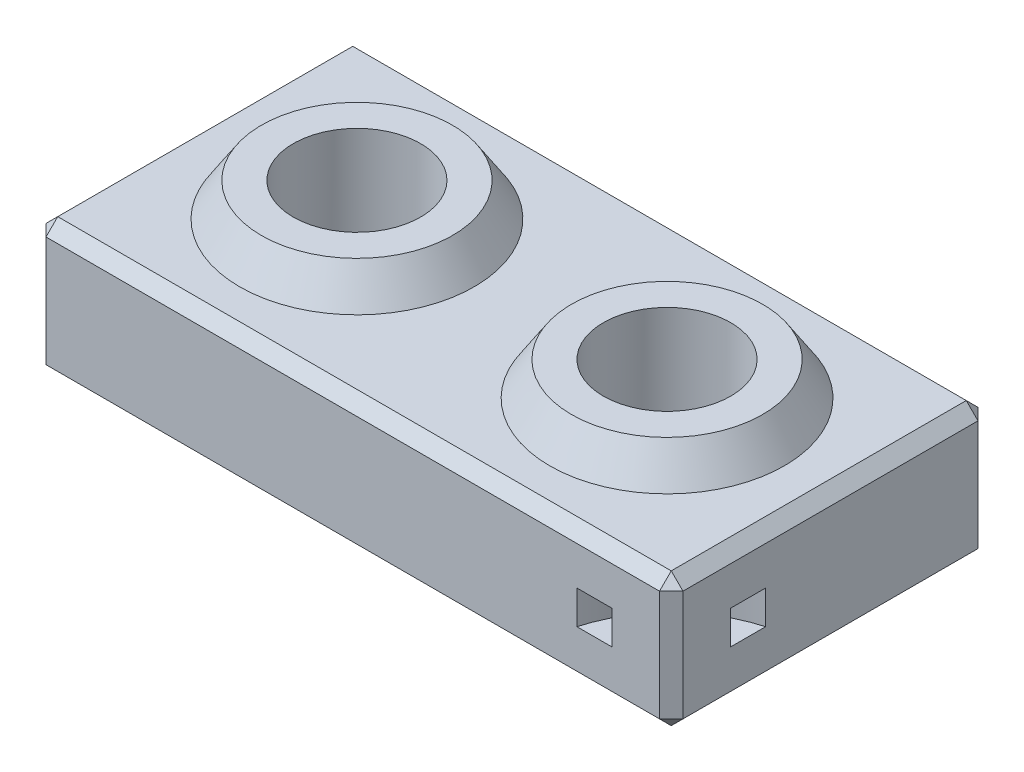
ISO-10303-21;
HEADER;
FILE_DESCRIPTION(('STEP AP214'),'2;1');
FILE_NAME('part.step','',(''),(''),'','','');
FILE_SCHEMA(('AUTOMOTIVE_DESIGN { 1 0 10303 214 1 1 1 1 }'));
ENDSEC;
DATA;
#1=APPLICATION_CONTEXT('core data for automotive mechanical design processes');
#2=APPLICATION_PROTOCOL_DEFINITION('international standard','automotive_design',2000,#1);
#3=PRODUCT_CONTEXT('',#1,'mechanical');
#4=PRODUCT('Part','Part','',(#3));
#5=PRODUCT_RELATED_PRODUCT_CATEGORY('part','',(#4));
#6=PRODUCT_DEFINITION_FORMATION('','',#4);
#7=PRODUCT_DEFINITION_CONTEXT('part definition',#1,'design');
#8=PRODUCT_DEFINITION('design','',#6,#7);
#9=PRODUCT_DEFINITION_SHAPE('','',#8);
#10=(LENGTH_UNIT() NAMED_UNIT(*) SI_UNIT(.MILLI.,.METRE.));
#11=(NAMED_UNIT(*) PLANE_ANGLE_UNIT() SI_UNIT($,.RADIAN.));
#12=(NAMED_UNIT(*) SI_UNIT($,.STERADIAN.) SOLID_ANGLE_UNIT());
#13=UNCERTAINTY_MEASURE_WITH_UNIT(LENGTH_MEASURE(1.E-05),#10,'distance_accuracy_value','');
#14=(GEOMETRIC_REPRESENTATION_CONTEXT(3) GLOBAL_UNCERTAINTY_ASSIGNED_CONTEXT((#13)) GLOBAL_UNIT_ASSIGNED_CONTEXT((#10,
#11,#12)) REPRESENTATION_CONTEXT('',''));
#15=CARTESIAN_POINT('',(0.,0.,0.));
#16=DIRECTION('',(0.,0.,1.));
#17=DIRECTION('',(1.,0.,0.));
#18=AXIS2_PLACEMENT_3D('',#15,#16,#17);
#19=CARTESIAN_POINT('',(9.25,0.,0.));
#20=DIRECTION('',(0.,1.,0.));
#21=DIRECTION('',(0.,0.,1.));
#22=AXIS2_PLACEMENT_3D('',#19,#20,#21);
#23=CYLINDRICAL_SURFACE('',#22,3.8);
#24=CARTESIAN_POINT('',(9.25,10.,0.));
#25=DIRECTION('',(0.,1.,0.));
#26=DIRECTION('',(0.,0.,1.));
#27=AXIS2_PLACEMENT_3D('',#24,#25,#26);
#28=CIRCLE('',#27,3.8);
#29=CARTESIAN_POINT('',(9.25,10.,3.8));
#30=VERTEX_POINT('',#29);
#31=EDGE_CURVE('E181',#30,#30,#28,.T.);
#32=ORIENTED_EDGE('',*,*,#31,.T.);
#33=EDGE_LOOP('',(#32));
#34=FACE_BOUND('',#33,.T.);
#35=CARTESIAN_POINT('',(9.25,2.2,0.));
#36=DIRECTION('',(0.,-1.,0.));
#37=DIRECTION('',(0.,0.,-1.));
#38=AXIS2_PLACEMENT_3D('',#35,#36,#37);
#39=CIRCLE('',#38,3.8);
#40=CARTESIAN_POINT('',(9.25,2.2,-3.8));
#41=VERTEX_POINT('',#40);
#42=EDGE_CURVE('E271',#41,#41,#39,.F.);
#43=ORIENTED_EDGE('',*,*,#42,.F.);
#44=EDGE_LOOP('',(#43));
#45=FACE_BOUND('',#44,.T.);
#46=ADVANCED_FACE('F37',(#34,#45),#23,.F.);
#47=CARTESIAN_POINT('',(-9.25,0.,0.));
#48=DIRECTION('',(0.,1.,0.));
#49=DIRECTION('',(0.,0.,1.));
#50=AXIS2_PLACEMENT_3D('',#47,#48,#49);
#51=CYLINDRICAL_SURFACE('',#50,3.8);
#52=CARTESIAN_POINT('',(-9.25,10.,0.));
#53=DIRECTION('',(0.,1.,0.));
#54=DIRECTION('',(0.,0.,1.));
#55=AXIS2_PLACEMENT_3D('',#52,#53,#54);
#56=CIRCLE('',#55,3.8);
#57=CARTESIAN_POINT('',(-9.25,10.,3.8));
#58=VERTEX_POINT('',#57);
#59=EDGE_CURVE('E186',#58,#58,#56,.T.);
#60=ORIENTED_EDGE('',*,*,#59,.T.);
#61=EDGE_LOOP('',(#60));
#62=FACE_BOUND('',#61,.T.);
#63=CARTESIAN_POINT('',(-9.25,2.2,0.));
#64=DIRECTION('',(0.,-1.,0.));
#65=DIRECTION('',(0.,0.,-1.));
#66=AXIS2_PLACEMENT_3D('',#63,#64,#65);
#67=CIRCLE('',#66,3.8);
#68=CARTESIAN_POINT('',(-9.25,2.2,-3.8));
#69=VERTEX_POINT('',#68);
#70=EDGE_CURVE('E176',#69,#69,#67,.F.);
#71=ORIENTED_EDGE('',*,*,#70,.F.);
#72=EDGE_LOOP('',(#71));
#73=FACE_BOUND('',#72,.T.);
#74=ADVANCED_FACE('F427',(#62,#73),#51,.F.);
#75=CARTESIAN_POINT('',(19.,8.,-9.5));
#76=DIRECTION('',(-1.,0.,0.));
#77=DIRECTION('',(0.,0.,1.));
#78=AXIS2_PLACEMENT_3D('',#75,#76,#77);
#79=PLANE('',#78);
#80=DIRECTION('',(0.,0.,-1.));
#81=VECTOR('',#80,1.);
#82=CARTESIAN_POINT('',(19.,5.,-9.5));
#83=LINE('',#82,#81);
#84=CARTESIAN_POINT('',(19.,5.,5.97568113595216));
#85=VERTEX_POINT('',#84);
#86=CARTESIAN_POINT('',(19.,5.,3.86762218499362));
#87=VERTEX_POINT('',#86);
#88=EDGE_CURVE('E154',#85,#87,#83,.T.);
#89=ORIENTED_EDGE('',*,*,#88,.T.);
#90=DIRECTION('',(0.,1.,0.));
#91=VECTOR('',#90,1.);
#92=CARTESIAN_POINT('',(19.,3.,3.86762218499362));
#93=LINE('',#92,#91);
#94=CARTESIAN_POINT('',(19.,3.,3.86762218499362));
#95=VERTEX_POINT('',#94);
#96=EDGE_CURVE('E170',#87,#95,#93,.F.);
#97=ORIENTED_EDGE('',*,*,#96,.T.);
#98=DIRECTION('',(0.,0.,-1.));
#99=VECTOR('',#98,1.);
#100=CARTESIAN_POINT('',(19.,3.,-9.5));
#101=LINE('',#100,#99);
#102=CARTESIAN_POINT('',(19.,3.,5.97568113595216));
#103=VERTEX_POINT('',#102);
#104=EDGE_CURVE('E160',#103,#95,#101,.T.);
#105=ORIENTED_EDGE('',*,*,#104,.F.);
#106=DIRECTION('',(0.,1.,0.));
#107=VECTOR('',#106,1.);
#108=CARTESIAN_POINT('',(19.,3.,5.97568113595216));
#109=LINE('',#108,#107);
#110=EDGE_CURVE('E148',#85,#103,#109,.F.);
#111=ORIENTED_EDGE('',*,*,#110,.F.);
#112=EDGE_LOOP('',(#89,#97,#105,#111));
#113=FACE_BOUND('',#112,.T.);
#114=DIRECTION('',(0.,0.,-1.));
#115=VECTOR('',#114,1.);
#116=CARTESIAN_POINT('',(19.,0.699999999999999,-9.5));
#117=LINE('',#116,#115);
#118=CARTESIAN_POINT('',(19.,0.699999999999999,8.8));
#119=VERTEX_POINT('',#118);
#120=CARTESIAN_POINT('',(19.,0.699999999999999,-8.8));
#121=VERTEX_POINT('',#120);
#122=EDGE_CURVE('E205',#119,#121,#117,.T.);
#123=ORIENTED_EDGE('',*,*,#122,.T.);
#124=DIRECTION('',(0.,1.,0.));
#125=VECTOR('',#124,1.);
#126=CARTESIAN_POINT('',(19.,8.,-8.8));
#127=LINE('',#126,#125);
#128=CARTESIAN_POINT('',(19.,7.3,-8.8));
#129=VERTEX_POINT('',#128);
#130=EDGE_CURVE('E212',#121,#129,#127,.T.);
#131=ORIENTED_EDGE('',*,*,#130,.T.);
#132=DIRECTION('',(0.,0.,1.));
#133=VECTOR('',#132,1.);
#134=CARTESIAN_POINT('',(19.,7.3,9.5));
#135=LINE('',#134,#133);
#136=CARTESIAN_POINT('',(19.,7.3,8.8));
#137=VERTEX_POINT('',#136);
#138=EDGE_CURVE('E208',#129,#137,#135,.T.);
#139=ORIENTED_EDGE('',*,*,#138,.T.);
#140=DIRECTION('',(0.,-1.,0.));
#141=VECTOR('',#140,1.);
#142=CARTESIAN_POINT('',(19.,8.,8.8));
#143=LINE('',#142,#141);
#144=EDGE_CURVE('E202',#137,#119,#143,.T.);
#145=ORIENTED_EDGE('',*,*,#144,.T.);
#146=EDGE_LOOP('',(#123,#131,#139,#145));
#147=FACE_BOUND('',#146,.T.);
#148=ADVANCED_FACE('F168',(#113,#147),#79,.F.);
#149=CARTESIAN_POINT('',(-19.,8.,-9.5));
#150=DIRECTION('',(0.,0.,1.));
#151=DIRECTION('',(1.,0.,0.));
#152=AXIS2_PLACEMENT_3D('',#149,#150,#151);
#153=PLANE('',#152);
#154=DIRECTION('',(1.,0.,0.));
#155=VECTOR('',#154,1.);
#156=CARTESIAN_POINT('',(19.,7.3,-9.5));
#157=LINE('',#156,#155);
#158=CARTESIAN_POINT('',(-18.3,7.3,-9.5));
#159=VERTEX_POINT('',#158);
#160=CARTESIAN_POINT('',(18.3,7.3,-9.5));
#161=VERTEX_POINT('',#160);
#162=EDGE_CURVE('E234',#159,#161,#157,.T.);
#163=ORIENTED_EDGE('',*,*,#162,.T.);
#164=DIRECTION('',(0.,-1.,0.));
#165=VECTOR('',#164,1.);
#166=CARTESIAN_POINT('',(18.3,8.,-9.5));
#167=LINE('',#166,#165);
#168=CARTESIAN_POINT('',(18.3,0.699999999999999,-9.5));
#169=VERTEX_POINT('',#168);
#170=EDGE_CURVE('E237',#161,#169,#167,.T.);
#171=ORIENTED_EDGE('',*,*,#170,.T.);
#172=DIRECTION('',(-1.,0.,0.));
#173=VECTOR('',#172,1.);
#174=CARTESIAN_POINT('',(-19.,0.699999999999999,-9.5));
#175=LINE('',#174,#173);
#176=CARTESIAN_POINT('',(-18.3,0.699999999999999,-9.5));
#177=VERTEX_POINT('',#176);
#178=EDGE_CURVE('E231',#169,#177,#175,.T.);
#179=ORIENTED_EDGE('',*,*,#178,.T.);
#180=DIRECTION('',(0.,1.,0.));
#181=VECTOR('',#180,1.);
#182=CARTESIAN_POINT('',(-18.3,8.,-9.5));
#183=LINE('',#182,#181);
#184=EDGE_CURVE('E228',#177,#159,#183,.T.);
#185=ORIENTED_EDGE('',*,*,#184,.T.);
#186=EDGE_LOOP('',(#163,#171,#179,#185));
#187=FACE_BOUND('',#186,.T.);
#188=ADVANCED_FACE('F462',(#187),#153,.F.);
#189=CARTESIAN_POINT('',(-19.,8.,-9.5));
#190=DIRECTION('',(1.,0.,0.));
#191=DIRECTION('',(0.,0.,-1.));
#192=AXIS2_PLACEMENT_3D('',#189,#190,#191);
#193=PLANE('',#192);
#194=DIRECTION('',(0.,0.,-1.));
#195=VECTOR('',#194,1.);
#196=CARTESIAN_POINT('',(-19.,7.3,-9.5));
#197=LINE('',#196,#195);
#198=CARTESIAN_POINT('',(-19.,7.3,8.8));
#199=VERTEX_POINT('',#198);
#200=CARTESIAN_POINT('',(-19.,7.3,-8.8));
#201=VERTEX_POINT('',#200);
#202=EDGE_CURVE('E247',#199,#201,#197,.T.);
#203=ORIENTED_EDGE('',*,*,#202,.T.);
#204=DIRECTION('',(0.,-1.,0.));
#205=VECTOR('',#204,1.);
#206=CARTESIAN_POINT('',(-19.,8.,-8.8));
#207=LINE('',#206,#205);
#208=CARTESIAN_POINT('',(-19.,0.699999999999999,-8.8));
#209=VERTEX_POINT('',#208);
#210=EDGE_CURVE('E250',#201,#209,#207,.T.);
#211=ORIENTED_EDGE('',*,*,#210,.T.);
#212=DIRECTION('',(0.,0.,1.));
#213=VECTOR('',#212,1.);
#214=CARTESIAN_POINT('',(-19.,0.699999999999999,-9.5));
#215=LINE('',#214,#213);
#216=CARTESIAN_POINT('',(-19.,0.699999999999999,8.8));
#217=VERTEX_POINT('',#216);
#218=EDGE_CURVE('E244',#209,#217,#215,.T.);
#219=ORIENTED_EDGE('',*,*,#218,.T.);
#220=DIRECTION('',(0.,1.,0.));
#221=VECTOR('',#220,1.);
#222=CARTESIAN_POINT('',(-19.,8.,8.8));
#223=LINE('',#222,#221);
#224=EDGE_CURVE('E241',#217,#199,#223,.T.);
#225=ORIENTED_EDGE('',*,*,#224,.T.);
#226=EDGE_LOOP('',(#203,#211,#219,#225));
#227=FACE_BOUND('',#226,.T.);
#228=ADVANCED_FACE('F459',(#227),#193,.F.);
#229=CARTESIAN_POINT('',(-19.,8.,9.5));
#230=DIRECTION('',(0.,0.,-1.));
#231=DIRECTION('',(-1.,0.,0.));
#232=AXIS2_PLACEMENT_3D('',#229,#230,#231);
#233=PLANE('',#232);
#234=DIRECTION('',(1.,0.,0.));
#235=VECTOR('',#234,1.);
#236=CARTESIAN_POINT('',(-19.,3.,9.5));
#237=LINE('',#236,#235);
#238=CARTESIAN_POINT('',(13.3676221849936,3.,9.5));
#239=VERTEX_POINT('',#238);
#240=CARTESIAN_POINT('',(15.4756811359522,3.,9.5));
#241=VERTEX_POINT('',#240);
#242=EDGE_CURVE('E46',#239,#241,#237,.T.);
#243=ORIENTED_EDGE('',*,*,#242,.F.);
#244=DIRECTION('',(0.,1.,0.));
#245=VECTOR('',#244,1.);
#246=CARTESIAN_POINT('',(13.3676221849936,3.,9.5));
#247=LINE('',#246,#245);
#248=CARTESIAN_POINT('',(13.3676221849936,5.,9.5));
#249=VERTEX_POINT('',#248);
#250=EDGE_CURVE('E11',#239,#249,#247,.T.);
#251=ORIENTED_EDGE('',*,*,#250,.T.);
#252=DIRECTION('',(1.,0.,0.));
#253=VECTOR('',#252,1.);
#254=CARTESIAN_POINT('',(-19.,5.,9.5));
#255=LINE('',#254,#253);
#256=CARTESIAN_POINT('',(15.4756811359522,5.,9.5));
#257=VERTEX_POINT('',#256);
#258=EDGE_CURVE('E398',#249,#257,#255,.T.);
#259=ORIENTED_EDGE('',*,*,#258,.T.);
#260=DIRECTION('',(0.,1.,0.));
#261=VECTOR('',#260,1.);
#262=CARTESIAN_POINT('',(15.4756811359522,3.,9.5));
#263=LINE('',#262,#261);
#264=EDGE_CURVE('E395',#241,#257,#263,.T.);
#265=ORIENTED_EDGE('',*,*,#264,.F.);
#266=EDGE_LOOP('',(#243,#251,#259,#265));
#267=FACE_BOUND('',#266,.T.);
#268=DIRECTION('',(-1.,0.,0.));
#269=VECTOR('',#268,1.);
#270=CARTESIAN_POINT('',(-19.,7.3,9.5));
#271=LINE('',#270,#269);
#272=CARTESIAN_POINT('',(18.3,7.3,9.5));
#273=VERTEX_POINT('',#272);
#274=CARTESIAN_POINT('',(-18.3,7.3,9.5));
#275=VERTEX_POINT('',#274);
#276=EDGE_CURVE('E260',#273,#275,#271,.T.);
#277=ORIENTED_EDGE('',*,*,#276,.T.);
#278=DIRECTION('',(0.,-1.,0.));
#279=VECTOR('',#278,1.);
#280=CARTESIAN_POINT('',(-18.3,8.,9.5));
#281=LINE('',#280,#279);
#282=CARTESIAN_POINT('',(-18.3,0.699999999999999,9.5));
#283=VERTEX_POINT('',#282);
#284=EDGE_CURVE('E263',#275,#283,#281,.T.);
#285=ORIENTED_EDGE('',*,*,#284,.T.);
#286=DIRECTION('',(1.,0.,0.));
#287=VECTOR('',#286,1.);
#288=CARTESIAN_POINT('',(-19.,0.699999999999999,9.5));
#289=LINE('',#288,#287);
#290=CARTESIAN_POINT('',(18.3,0.699999999999999,9.5));
#291=VERTEX_POINT('',#290);
#292=EDGE_CURVE('E254',#283,#291,#289,.T.);
#293=ORIENTED_EDGE('',*,*,#292,.T.);
#294=DIRECTION('',(0.,1.,0.));
#295=VECTOR('',#294,1.);
#296=CARTESIAN_POINT('',(18.3,8.,9.5));
#297=LINE('',#296,#295);
#298=EDGE_CURVE('E257',#291,#273,#297,.T.);
#299=ORIENTED_EDGE('',*,*,#298,.T.);
#300=EDGE_LOOP('',(#277,#285,#293,#299));
#301=FACE_BOUND('',#300,.T.);
#302=ADVANCED_FACE('F414',(#267,#301),#233,.F.);
#303=CARTESIAN_POINT('',(0.,8.,0.));
#304=DIRECTION('',(0.,1.,0.));
#305=DIRECTION('',(0.,0.,1.));
#306=AXIS2_PLACEMENT_3D('',#303,#304,#305);
#307=PLANE('',#306);
#308=CARTESIAN_POINT('',(9.25,8.,0.));
#309=DIRECTION('',(0.,1.,0.));
#310=DIRECTION('',(0.,0.,1.));
#311=AXIS2_PLACEMENT_3D('',#308,#309,#310);
#312=CIRCLE('',#311,7.00000000000002);
#313=CARTESIAN_POINT('',(9.25,8.,7.00000000000002));
#314=VERTEX_POINT('',#313);
#315=EDGE_CURVE('E375',#314,#314,#312,.F.);
#316=ORIENTED_EDGE('',*,*,#315,.T.);
#317=EDGE_LOOP('',(#316));
#318=FACE_BOUND('',#317,.T.);
#319=CARTESIAN_POINT('',(-9.25,8.,0.));
#320=DIRECTION('',(0.,1.,0.));
#321=DIRECTION('',(0.,0.,1.));
#322=AXIS2_PLACEMENT_3D('',#319,#320,#321);
#323=CIRCLE('',#322,7.00000000000002);
#324=CARTESIAN_POINT('',(-9.25,8.,7.00000000000002));
#325=VERTEX_POINT('',#324);
#326=EDGE_CURVE('E371',#325,#325,#323,.F.);
#327=ORIENTED_EDGE('',*,*,#326,.T.);
#328=EDGE_LOOP('',(#327));
#329=FACE_BOUND('',#328,.T.);
#330=DIRECTION('',(1.,0.,0.));
#331=VECTOR('',#330,1.);
#332=CARTESIAN_POINT('',(19.,8.,8.8));
#333=LINE('',#332,#331);
#334=CARTESIAN_POINT('',(-18.3,8.,8.8));
#335=VERTEX_POINT('',#334);
#336=CARTESIAN_POINT('',(18.3,8.,8.8));
#337=VERTEX_POINT('',#336);
#338=EDGE_CURVE('E185',#335,#337,#333,.T.);
#339=ORIENTED_EDGE('',*,*,#338,.T.);
#340=DIRECTION('',(0.,0.,-1.));
#341=VECTOR('',#340,1.);
#342=CARTESIAN_POINT('',(18.3,8.,-9.5));
#343=LINE('',#342,#341);
#344=CARTESIAN_POINT('',(18.3,8.,-8.8));
#345=VERTEX_POINT('',#344);
#346=EDGE_CURVE('E198',#337,#345,#343,.T.);
#347=ORIENTED_EDGE('',*,*,#346,.T.);
#348=DIRECTION('',(-1.,0.,0.));
#349=VECTOR('',#348,1.);
#350=CARTESIAN_POINT('',(-19.,8.,-8.8));
#351=LINE('',#350,#349);
#352=CARTESIAN_POINT('',(-18.3,8.,-8.8));
#353=VERTEX_POINT('',#352);
#354=EDGE_CURVE('E195',#345,#353,#351,.T.);
#355=ORIENTED_EDGE('',*,*,#354,.T.);
#356=DIRECTION('',(0.,0.,1.));
#357=VECTOR('',#356,1.);
#358=CARTESIAN_POINT('',(-18.3,8.,9.5));
#359=LINE('',#358,#357);
#360=EDGE_CURVE('E192',#353,#335,#359,.T.);
#361=ORIENTED_EDGE('',*,*,#360,.T.);
#362=EDGE_LOOP('',(#339,#347,#355,#361));
#363=FACE_BOUND('',#362,.T.);
#364=ADVANCED_FACE('F450',(#318,#329,#363),#307,.T.);
#365=CARTESIAN_POINT('',(0.,0.,0.));
#366=DIRECTION('',(0.,1.,0.));
#367=DIRECTION('',(0.,0.,1.));
#368=AXIS2_PLACEMENT_3D('',#365,#366,#367);
#369=PLANE('',#368);
#370=CARTESIAN_POINT('',(-9.25,0.,0.));
#371=DIRECTION('',(0.,1.,0.));
#372=DIRECTION('',(0.,0.,1.));
#373=AXIS2_PLACEMENT_3D('',#370,#371,#372);
#374=CIRCLE('',#373,7.25000000000002);
#375=CARTESIAN_POINT('',(-9.25,0.,7.25000000000002));
#376=VERTEX_POINT('',#375);
#377=EDGE_CURVE('E367',#376,#376,#374,.T.);
#378=ORIENTED_EDGE('',*,*,#377,.T.);
#379=EDGE_LOOP('',(#378));
#380=FACE_BOUND('',#379,.T.);
#381=CARTESIAN_POINT('',(9.25,0.,0.));
#382=DIRECTION('',(0.,1.,0.));
#383=DIRECTION('',(0.,0.,1.));
#384=AXIS2_PLACEMENT_3D('',#381,#382,#383);
#385=CIRCLE('',#384,7.25000000000002);
#386=CARTESIAN_POINT('',(9.25,0.,7.25000000000002));
#387=VERTEX_POINT('',#386);
#388=EDGE_CURVE('E266',#387,#387,#385,.T.);
#389=ORIENTED_EDGE('',*,*,#388,.T.);
#390=EDGE_LOOP('',(#389));
#391=FACE_BOUND('',#390,.T.);
#392=DIRECTION('',(1.,0.,0.));
#393=VECTOR('',#392,1.);
#394=CARTESIAN_POINT('',(0.,0.,-8.8));
#395=LINE('',#394,#393);
#396=CARTESIAN_POINT('',(-18.3,0.,-8.8));
#397=VERTEX_POINT('',#396);
#398=CARTESIAN_POINT('',(18.3,0.,-8.8));
#399=VERTEX_POINT('',#398);
#400=EDGE_CURVE('E221',#397,#399,#395,.T.);
#401=ORIENTED_EDGE('',*,*,#400,.T.);
#402=DIRECTION('',(0.,0.,1.));
#403=VECTOR('',#402,1.);
#404=CARTESIAN_POINT('',(18.3,0.,0.));
#405=LINE('',#404,#403);
#406=CARTESIAN_POINT('',(18.3,0.,8.8));
#407=VERTEX_POINT('',#406);
#408=EDGE_CURVE('E224',#399,#407,#405,.T.);
#409=ORIENTED_EDGE('',*,*,#408,.T.);
#410=DIRECTION('',(-1.,0.,0.));
#411=VECTOR('',#410,1.);
#412=CARTESIAN_POINT('',(0.,0.,8.8));
#413=LINE('',#412,#411);
#414=CARTESIAN_POINT('',(-18.3,0.,8.8));
#415=VERTEX_POINT('',#414);
#416=EDGE_CURVE('E215',#407,#415,#413,.T.);
#417=ORIENTED_EDGE('',*,*,#416,.T.);
#418=DIRECTION('',(0.,0.,-1.));
#419=VECTOR('',#418,1.);
#420=CARTESIAN_POINT('',(-18.3,0.,0.));
#421=LINE('',#420,#419);
#422=EDGE_CURVE('E218',#415,#397,#421,.T.);
#423=ORIENTED_EDGE('',*,*,#422,.T.);
#424=EDGE_LOOP('',(#401,#409,#417,#423));
#425=FACE_BOUND('',#424,.T.);
#426=ADVANCED_FACE('F448',(#380,#391,#425),#369,.F.);
#427=CARTESIAN_POINT('',(-9.25,10.,0.));
#428=DIRECTION('',(0.,1.,0.));
#429=DIRECTION('',(0.,0.,1.));
#430=AXIS2_PLACEMENT_3D('',#427,#428,#429);
#431=PLANE('',#430);
#432=CARTESIAN_POINT('',(-9.25,10.,0.));
#433=DIRECTION('',(0.,1.,0.));
#434=DIRECTION('',(0.,0.,1.));
#435=AXIS2_PLACEMENT_3D('',#432,#433,#434);
#436=CIRCLE('',#435,5.70118481360501);
#437=CARTESIAN_POINT('',(-9.25,10.,5.70118481360501));
#438=VERTEX_POINT('',#437);
#439=EDGE_CURVE('E391',#438,#438,#436,.T.);
#440=ORIENTED_EDGE('',*,*,#439,.T.);
#441=EDGE_LOOP('',(#440));
#442=FACE_BOUND('',#441,.T.);
#443=ORIENTED_EDGE('',*,*,#59,.F.);
#444=EDGE_LOOP('',(#443));
#445=FACE_BOUND('',#444,.T.);
#446=ADVANCED_FACE('F444',(#442,#445),#431,.T.);
#447=CARTESIAN_POINT('',(9.25,10.,0.));
#448=DIRECTION('',(0.,1.,0.));
#449=DIRECTION('',(0.,0.,1.));
#450=AXIS2_PLACEMENT_3D('',#447,#448,#449);
#451=PLANE('',#450);
#452=CARTESIAN_POINT('',(9.25,10.,0.));
#453=DIRECTION('',(0.,1.,0.));
#454=DIRECTION('',(0.,0.,1.));
#455=AXIS2_PLACEMENT_3D('',#452,#453,#454);
#456=CIRCLE('',#455,5.70118481360501);
#457=CARTESIAN_POINT('',(9.25,10.,5.70118481360501));
#458=VERTEX_POINT('',#457);
#459=EDGE_CURVE('E387',#458,#458,#456,.T.);
#460=ORIENTED_EDGE('',*,*,#459,.T.);
#461=EDGE_LOOP('',(#460));
#462=FACE_BOUND('',#461,.T.);
#463=ORIENTED_EDGE('',*,*,#31,.F.);
#464=EDGE_LOOP('',(#463));
#465=FACE_BOUND('',#464,.T.);
#466=ADVANCED_FACE('F440',(#462,#465),#451,.T.);
#467=CARTESIAN_POINT('',(-19.,0.699999999999999,-9.5));
#468=DIRECTION('',(0.707106781186546,0.707106781186549,0.));
#469=DIRECTION('',(0.,0.,1.));
#470=AXIS2_PLACEMENT_3D('',#467,#468,#469);
#471=PLANE('',#470);
#472=DIRECTION('',(-0.707106781186549,0.707106781186546,0.));
#473=VECTOR('',#472,1.);
#474=CARTESIAN_POINT('',(-19.,0.699999999999999,8.8));
#475=LINE('',#474,#473);
#476=EDGE_CURVE('E189',#217,#415,#475,.F.);
#477=ORIENTED_EDGE('',*,*,#476,.F.);
#478=ORIENTED_EDGE('',*,*,#218,.F.);
#479=DIRECTION('',(0.707106781186549,-0.707106781186546,0.));
#480=VECTOR('',#479,1.);
#481=CARTESIAN_POINT('',(-18.65,0.35,-8.8));
#482=LINE('',#481,#480);
#483=EDGE_CURVE('E351',#397,#209,#482,.F.);
#484=ORIENTED_EDGE('',*,*,#483,.F.);
#485=ORIENTED_EDGE('',*,*,#422,.F.);
#486=EDGE_LOOP('',(#477,#478,#484,#485));
#487=FACE_BOUND('',#486,.T.);
#488=ADVANCED_FACE('F443',(#487),#471,.F.);
#489=CARTESIAN_POINT('',(-19.,0.699999999999999,8.8));
#490=DIRECTION('',(-0.577350269189626,-0.577350269189629,0.577350269189623));
#491=DIRECTION('',(0.707106781186549,-0.707106781186546,0.));
#492=AXIS2_PLACEMENT_3D('',#489,#490,#491);
#493=PLANE('',#492);
#494=DIRECTION('',(0.707106781186546,0.,0.707106781186549));
#495=VECTOR('',#494,1.);
#496=CARTESIAN_POINT('',(-19.,0.699999999999999,8.8));
#497=LINE('',#496,#495);
#498=EDGE_CURVE('E343',#217,#283,#497,.T.);
#499=ORIENTED_EDGE('',*,*,#498,.F.);
#500=ORIENTED_EDGE('',*,*,#476,.T.);
#501=DIRECTION('',(0.,-0.707106781186546,-0.707106781186549));
#502=VECTOR('',#501,1.);
#503=CARTESIAN_POINT('',(-18.3,0.35,9.15));
#504=LINE('',#503,#502);
#505=EDGE_CURVE('E347',#283,#415,#504,.T.);
#506=ORIENTED_EDGE('',*,*,#505,.F.);
#507=EDGE_LOOP('',(#499,#500,#506));
#508=FACE_BOUND('',#507,.T.);
#509=ADVANCED_FACE('F540',(#508),#493,.T.);
#510=CARTESIAN_POINT('',(-18.3,0.699999999999999,-9.5));
#511=DIRECTION('',(-0.577350269189623,-0.577350269189629,-0.577350269189626));
#512=DIRECTION('',(0.,0.707106781186546,-0.707106781186549));
#513=AXIS2_PLACEMENT_3D('',#510,#511,#512);
#514=PLANE('',#513);
#515=DIRECTION('',(0.,0.707106781186546,-0.707106781186549));
#516=VECTOR('',#515,1.);
#517=CARTESIAN_POINT('',(-18.3,0.699999999999999,-9.5));
#518=LINE('',#517,#516);
#519=EDGE_CURVE('E336',#397,#177,#518,.T.);
#520=ORIENTED_EDGE('',*,*,#519,.F.);
#521=ORIENTED_EDGE('',*,*,#483,.T.);
#522=DIRECTION('',(-0.707106781186549,0.,0.707106781186546));
#523=VECTOR('',#522,1.);
#524=CARTESIAN_POINT('',(-18.3,0.699999999999999,-9.5));
#525=LINE('',#524,#523);
#526=EDGE_CURVE('E340',#177,#209,#525,.T.);
#527=ORIENTED_EDGE('',*,*,#526,.F.);
#528=EDGE_LOOP('',(#520,#521,#527));
#529=FACE_BOUND('',#528,.T.);
#530=ADVANCED_FACE('F536',(#529),#514,.T.);
#531=CARTESIAN_POINT('',(-19.,0.699999999999999,9.5));
#532=DIRECTION('',(0.,0.707106781186549,-0.707106781186546));
#533=DIRECTION('',(1.,0.,0.));
#534=AXIS2_PLACEMENT_3D('',#531,#532,#533);
#535=PLANE('',#534);
#536=ORIENTED_EDGE('',*,*,#505,.T.);
#537=ORIENTED_EDGE('',*,*,#416,.F.);
#538=DIRECTION('',(0.,0.707106781186546,0.707106781186549));
#539=VECTOR('',#538,1.);
#540=CARTESIAN_POINT('',(18.3,0.,8.8));
#541=LINE('',#540,#539);
#542=EDGE_CURVE('E329',#291,#407,#541,.F.);
#543=ORIENTED_EDGE('',*,*,#542,.F.);
#544=ORIENTED_EDGE('',*,*,#292,.F.);
#545=EDGE_LOOP('',(#536,#537,#543,#544));
#546=FACE_BOUND('',#545,.T.);
#547=ADVANCED_FACE('F532',(#546),#535,.F.);
#548=CARTESIAN_POINT('',(-18.3,8.,9.5));
#549=DIRECTION('',(0.707106781186549,0.,-0.707106781186546));
#550=DIRECTION('',(0.,-1.,0.));
#551=AXIS2_PLACEMENT_3D('',#548,#549,#550);
#552=PLANE('',#551);
#553=ORIENTED_EDGE('',*,*,#498,.T.);
#554=ORIENTED_EDGE('',*,*,#284,.F.);
#555=DIRECTION('',(-0.707106781186546,0.,-0.707106781186549));
#556=VECTOR('',#555,1.);
#557=CARTESIAN_POINT('',(-18.65,7.3,9.15));
#558=LINE('',#557,#556);
#559=EDGE_CURVE('E325',#199,#275,#558,.F.);
#560=ORIENTED_EDGE('',*,*,#559,.F.);
#561=ORIENTED_EDGE('',*,*,#224,.F.);
#562=EDGE_LOOP('',(#553,#554,#560,#561));
#563=FACE_BOUND('',#562,.T.);
#564=ADVANCED_FACE('F528',(#563),#552,.F.);
#565=CARTESIAN_POINT('',(-18.3,8.,0.));
#566=DIRECTION('',(-0.707106781186549,0.707106781186546,0.));
#567=DIRECTION('',(0.,0.,-1.));
#568=AXIS2_PLACEMENT_3D('',#565,#566,#567);
#569=PLANE('',#568);
#570=DIRECTION('',(0.707106781186546,0.707106781186549,0.));
#571=VECTOR('',#570,1.);
#572=CARTESIAN_POINT('',(-18.3,8.,-8.8));
#573=LINE('',#572,#571);
#574=EDGE_CURVE('E317',#201,#353,#573,.T.);
#575=ORIENTED_EDGE('',*,*,#574,.F.);
#576=ORIENTED_EDGE('',*,*,#202,.F.);
#577=DIRECTION('',(-0.707106781186546,-0.707106781186549,0.));
#578=VECTOR('',#577,1.);
#579=CARTESIAN_POINT('',(-18.3,8.,8.8));
#580=LINE('',#579,#578);
#581=EDGE_CURVE('E321',#335,#199,#580,.T.);
#582=ORIENTED_EDGE('',*,*,#581,.F.);
#583=ORIENTED_EDGE('',*,*,#360,.F.);
#584=EDGE_LOOP('',(#575,#576,#582,#583));
#585=FACE_BOUND('',#584,.T.);
#586=ADVANCED_FACE('F524',(#585),#569,.T.);
#587=CARTESIAN_POINT('',(-19.,8.,-8.8));
#588=DIRECTION('',(0.707106781186546,0.,0.707106781186549));
#589=DIRECTION('',(0.,-1.,0.));
#590=AXIS2_PLACEMENT_3D('',#587,#588,#589);
#591=PLANE('',#590);
#592=ORIENTED_EDGE('',*,*,#526,.T.);
#593=ORIENTED_EDGE('',*,*,#210,.F.);
#594=DIRECTION('',(0.707106781186549,0.,-0.707106781186546));
#595=VECTOR('',#594,1.);
#596=CARTESIAN_POINT('',(-18.65,7.3,-9.15));
#597=LINE('',#596,#595);
#598=EDGE_CURVE('E313',#159,#201,#597,.F.);
#599=ORIENTED_EDGE('',*,*,#598,.F.);
#600=ORIENTED_EDGE('',*,*,#184,.F.);
#601=EDGE_LOOP('',(#592,#593,#599,#600));
#602=FACE_BOUND('',#601,.T.);
#603=ADVANCED_FACE('F520',(#602),#591,.F.);
#604=CARTESIAN_POINT('',(-19.,0.699999999999999,-9.5));
#605=DIRECTION('',(0.,0.707106781186549,0.707106781186546));
#606=DIRECTION('',(-1.,0.,0.));
#607=AXIS2_PLACEMENT_3D('',#604,#605,#606);
#608=PLANE('',#607);
#609=ORIENTED_EDGE('',*,*,#519,.T.);
#610=ORIENTED_EDGE('',*,*,#178,.F.);
#611=DIRECTION('',(0.,-0.707106781186546,0.707106781186549));
#612=VECTOR('',#611,1.);
#613=CARTESIAN_POINT('',(18.3,0.35,-9.15));
#614=LINE('',#613,#612);
#615=EDGE_CURVE('E309',#399,#169,#614,.F.);
#616=ORIENTED_EDGE('',*,*,#615,.F.);
#617=ORIENTED_EDGE('',*,*,#400,.F.);
#618=EDGE_LOOP('',(#609,#610,#616,#617));
#619=FACE_BOUND('',#618,.T.);
#620=ADVANCED_FACE('F516',(#619),#608,.F.);
#621=CARTESIAN_POINT('',(19.,0.699999999999999,-9.5));
#622=DIRECTION('',(-0.707106781186545,0.70710678118655,0.));
#623=DIRECTION('',(0.,0.,-1.));
#624=AXIS2_PLACEMENT_3D('',#621,#622,#623);
#625=PLANE('',#624);
#626=DIRECTION('',(-0.70710678118655,-0.707106781186545,0.));
#627=VECTOR('',#626,1.);
#628=CARTESIAN_POINT('',(18.3,0.,8.8));
#629=LINE('',#628,#627);
#630=EDGE_CURVE('E332',#407,#119,#629,.F.);
#631=ORIENTED_EDGE('',*,*,#630,.F.);
#632=ORIENTED_EDGE('',*,*,#408,.F.);
#633=DIRECTION('',(0.70710678118655,0.707106781186545,0.));
#634=VECTOR('',#633,1.);
#635=CARTESIAN_POINT('',(19.,0.699999999999999,-8.8));
#636=LINE('',#635,#634);
#637=EDGE_CURVE('E305',#121,#399,#636,.F.);
#638=ORIENTED_EDGE('',*,*,#637,.F.);
#639=ORIENTED_EDGE('',*,*,#122,.F.);
#640=EDGE_LOOP('',(#631,#632,#638,#639));
#641=FACE_BOUND('',#640,.T.);
#642=ADVANCED_FACE('F512',(#641),#625,.F.);
#643=CARTESIAN_POINT('',(18.3,0.,8.8));
#644=DIRECTION('',(0.577350269189625,-0.577350269189628,0.577350269189625));
#645=DIRECTION('',(0.,-0.707106781186546,-0.707106781186549));
#646=AXIS2_PLACEMENT_3D('',#643,#644,#645);
#647=PLANE('',#646);
#648=ORIENTED_EDGE('',*,*,#542,.T.);
#649=ORIENTED_EDGE('',*,*,#630,.T.);
#650=DIRECTION('',(0.707106781186548,0.,-0.707106781186548));
#651=VECTOR('',#650,1.);
#652=CARTESIAN_POINT('',(18.65,0.699999999999999,9.15));
#653=LINE('',#652,#651);
#654=EDGE_CURVE('E301',#291,#119,#653,.T.);
#655=ORIENTED_EDGE('',*,*,#654,.F.);
#656=EDGE_LOOP('',(#648,#649,#655));
#657=FACE_BOUND('',#656,.T.);
#658=ADVANCED_FACE('F508',(#657),#647,.T.);
#659=CARTESIAN_POINT('',(-18.3,8.,8.8));
#660=DIRECTION('',(-0.577350269189629,0.577350269189626,0.577350269189623));
#661=DIRECTION('',(-0.707106781186546,-0.707106781186549,0.));
#662=AXIS2_PLACEMENT_3D('',#659,#660,#661);
#663=PLANE('',#662);
#664=ORIENTED_EDGE('',*,*,#581,.T.);
#665=ORIENTED_EDGE('',*,*,#559,.T.);
#666=DIRECTION('',(0.,0.707106781186546,-0.707106781186549));
#667=VECTOR('',#666,1.);
#668=CARTESIAN_POINT('',(-18.3,8.,8.8));
#669=LINE('',#668,#667);
#670=EDGE_CURVE('E297',#335,#275,#669,.F.);
#671=ORIENTED_EDGE('',*,*,#670,.F.);
#672=EDGE_LOOP('',(#664,#665,#671));
#673=FACE_BOUND('',#672,.T.);
#674=ADVANCED_FACE('F504',(#673),#663,.T.);
#675=CARTESIAN_POINT('',(-18.3,8.,-8.8));
#676=DIRECTION('',(-0.577350269189626,0.577350269189623,-0.577350269189629));
#677=DIRECTION('',(-0.707106781186549,0.,0.707106781186546));
#678=AXIS2_PLACEMENT_3D('',#675,#676,#677);
#679=PLANE('',#678);
#680=ORIENTED_EDGE('',*,*,#598,.T.);
#681=ORIENTED_EDGE('',*,*,#574,.T.);
#682=DIRECTION('',(0.,-0.707106781186549,-0.707106781186546));
#683=VECTOR('',#682,1.);
#684=CARTESIAN_POINT('',(-18.3,8.,-8.8));
#685=LINE('',#684,#683);
#686=EDGE_CURVE('E293',#159,#353,#685,.F.);
#687=ORIENTED_EDGE('',*,*,#686,.F.);
#688=EDGE_LOOP('',(#680,#681,#687));
#689=FACE_BOUND('',#688,.T.);
#690=ADVANCED_FACE('F500',(#689),#679,.T.);
#691=CARTESIAN_POINT('',(19.,0.699999999999999,-8.8));
#692=DIRECTION('',(0.577350269189626,-0.577350269189629,-0.577350269189623));
#693=DIRECTION('',(0.707106781186549,0.707106781186546,0.));
#694=AXIS2_PLACEMENT_3D('',#691,#692,#693);
#695=PLANE('',#694);
#696=ORIENTED_EDGE('',*,*,#637,.T.);
#697=ORIENTED_EDGE('',*,*,#615,.T.);
#698=DIRECTION('',(-0.707106781186546,0.,-0.707106781186549));
#699=VECTOR('',#698,1.);
#700=CARTESIAN_POINT('',(19.,0.699999999999999,-8.8));
#701=LINE('',#700,#699);
#702=EDGE_CURVE('E290',#121,#169,#701,.T.);
#703=ORIENTED_EDGE('',*,*,#702,.F.);
#704=EDGE_LOOP('',(#696,#697,#703));
#705=FACE_BOUND('',#704,.T.);
#706=ADVANCED_FACE('F496',(#705),#695,.T.);
#707=CARTESIAN_POINT('',(19.,8.,8.8));
#708=DIRECTION('',(-0.707106781186548,0.,-0.707106781186548));
#709=DIRECTION('',(0.,-1.,0.));
#710=AXIS2_PLACEMENT_3D('',#707,#708,#709);
#711=PLANE('',#710);
#712=ORIENTED_EDGE('',*,*,#654,.T.);
#713=ORIENTED_EDGE('',*,*,#144,.F.);
#714=DIRECTION('',(-0.707106781186548,0.,0.707106781186548));
#715=VECTOR('',#714,1.);
#716=CARTESIAN_POINT('',(19.,7.3,8.8));
#717=LINE('',#716,#715);
#718=EDGE_CURVE('E286',#273,#137,#717,.F.);
#719=ORIENTED_EDGE('',*,*,#718,.F.);
#720=ORIENTED_EDGE('',*,*,#298,.F.);
#721=EDGE_LOOP('',(#712,#713,#719,#720));
#722=FACE_BOUND('',#721,.T.);
#723=ADVANCED_FACE('F492',(#722),#711,.F.);
#724=CARTESIAN_POINT('',(0.,8.,8.8));
#725=DIRECTION('',(0.,0.707106781186549,0.707106781186546));
#726=DIRECTION('',(-1.,0.,0.));
#727=AXIS2_PLACEMENT_3D('',#724,#725,#726);
#728=PLANE('',#727);
#729=ORIENTED_EDGE('',*,*,#670,.T.);
#730=ORIENTED_EDGE('',*,*,#276,.F.);
#731=DIRECTION('',(0.,-0.707106781186546,0.707106781186549));
#732=VECTOR('',#731,1.);
#733=CARTESIAN_POINT('',(18.3,7.65,9.15));
#734=LINE('',#733,#732);
#735=EDGE_CURVE('E282',#337,#273,#734,.T.);
#736=ORIENTED_EDGE('',*,*,#735,.F.);
#737=ORIENTED_EDGE('',*,*,#338,.F.);
#738=EDGE_LOOP('',(#729,#730,#736,#737));
#739=FACE_BOUND('',#738,.T.);
#740=ADVANCED_FACE('F488',(#739),#728,.T.);
#741=CARTESIAN_POINT('',(0.,8.,-8.8));
#742=DIRECTION('',(0.,0.707106781186546,-0.707106781186549));
#743=DIRECTION('',(1.,0.,0.));
#744=AXIS2_PLACEMENT_3D('',#741,#742,#743);
#745=PLANE('',#744);
#746=ORIENTED_EDGE('',*,*,#686,.T.);
#747=ORIENTED_EDGE('',*,*,#354,.F.);
#748=DIRECTION('',(0.,0.707106781186549,0.707106781186546));
#749=VECTOR('',#748,1.);
#750=CARTESIAN_POINT('',(18.3,8.,-8.8));
#751=LINE('',#750,#749);
#752=EDGE_CURVE('E278',#161,#345,#751,.T.);
#753=ORIENTED_EDGE('',*,*,#752,.F.);
#754=ORIENTED_EDGE('',*,*,#162,.F.);
#755=EDGE_LOOP('',(#746,#747,#753,#754));
#756=FACE_BOUND('',#755,.T.);
#757=ADVANCED_FACE('F484',(#756),#745,.T.);
#758=CARTESIAN_POINT('',(18.3,8.,-9.5));
#759=DIRECTION('',(-0.707106781186549,0.,0.707106781186546));
#760=DIRECTION('',(0.,-1.,0.));
#761=AXIS2_PLACEMENT_3D('',#758,#759,#760);
#762=PLANE('',#761);
#763=ORIENTED_EDGE('',*,*,#702,.T.);
#764=ORIENTED_EDGE('',*,*,#170,.F.);
#765=DIRECTION('',(0.707106781186546,0.,0.707106781186549));
#766=VECTOR('',#765,1.);
#767=CARTESIAN_POINT('',(18.65,7.3,-9.15));
#768=LINE('',#767,#766);
#769=EDGE_CURVE('E274',#129,#161,#768,.F.);
#770=ORIENTED_EDGE('',*,*,#769,.F.);
#771=ORIENTED_EDGE('',*,*,#130,.F.);
#772=EDGE_LOOP('',(#763,#764,#770,#771));
#773=FACE_BOUND('',#772,.T.);
#774=ADVANCED_FACE('F480',(#773),#762,.F.);
#775=CARTESIAN_POINT('',(19.,7.3,8.8));
#776=DIRECTION('',(0.577350269189629,0.577350269189623,0.577350269189626));
#777=DIRECTION('',(0.707106781186546,0.,-0.707106781186549));
#778=AXIS2_PLACEMENT_3D('',#775,#776,#777);
#779=PLANE('',#778);
#780=ORIENTED_EDGE('',*,*,#735,.T.);
#781=ORIENTED_EDGE('',*,*,#718,.T.);
#782=DIRECTION('',(-0.707106781186545,0.70710678118655,0.));
#783=VECTOR('',#782,1.);
#784=CARTESIAN_POINT('',(19.,7.3,8.8));
#785=LINE('',#784,#783);
#786=EDGE_CURVE('E270',#337,#137,#785,.F.);
#787=ORIENTED_EDGE('',*,*,#786,.F.);
#788=EDGE_LOOP('',(#780,#781,#787));
#789=FACE_BOUND('',#788,.T.);
#790=ADVANCED_FACE('F476',(#789),#779,.T.);
#791=CARTESIAN_POINT('',(18.3,8.,-8.8));
#792=DIRECTION('',(0.57735026918963,0.577350269189621,-0.577350269189627));
#793=DIRECTION('',(-0.707106781186546,0.,-0.707106781186549));
#794=AXIS2_PLACEMENT_3D('',#791,#792,#793);
#795=PLANE('',#794);
#796=ORIENTED_EDGE('',*,*,#769,.T.);
#797=ORIENTED_EDGE('',*,*,#752,.T.);
#798=DIRECTION('',(0.707106781186545,-0.70710678118655,0.));
#799=VECTOR('',#798,1.);
#800=CARTESIAN_POINT('',(18.3,8.,-8.8));
#801=LINE('',#800,#799);
#802=EDGE_CURVE('E267',#129,#345,#801,.F.);
#803=ORIENTED_EDGE('',*,*,#802,.F.);
#804=EDGE_LOOP('',(#796,#797,#803));
#805=FACE_BOUND('',#804,.T.);
#806=ADVANCED_FACE('F472',(#805),#795,.T.);
#807=CARTESIAN_POINT('',(18.3,8.,0.));
#808=DIRECTION('',(0.70710678118655,0.707106781186545,0.));
#809=DIRECTION('',(0.,0.,1.));
#810=AXIS2_PLACEMENT_3D('',#807,#808,#809);
#811=PLANE('',#810);
#812=ORIENTED_EDGE('',*,*,#786,.T.);
#813=ORIENTED_EDGE('',*,*,#138,.F.);
#814=ORIENTED_EDGE('',*,*,#802,.T.);
#815=ORIENTED_EDGE('',*,*,#346,.F.);
#816=EDGE_LOOP('',(#812,#813,#814,#815));
#817=FACE_BOUND('',#816,.T.);
#818=ADVANCED_FACE('F469',(#817),#811,.T.);
#819=CARTESIAN_POINT('',(-9.25,2.2,0.));
#820=DIRECTION('',(0.,-1.,0.));
#821=DIRECTION('',(0.,0.,-1.));
#822=AXIS2_PLACEMENT_3D('',#819,#820,#821);
#823=PLANE('',#822);
#824=CARTESIAN_POINT('',(-9.25,2.2,0.));
#825=DIRECTION('',(0.,-1.,0.));
#826=DIRECTION('',(0.,0.,-1.));
#827=AXIS2_PLACEMENT_3D('',#824,#825,#826);
#828=CIRCLE('',#827,5.82130329496551);
#829=CARTESIAN_POINT('',(-9.25,2.2,-5.82130329496551));
#830=VERTEX_POINT('',#829);
#831=EDGE_CURVE('E379',#830,#830,#828,.T.);
#832=ORIENTED_EDGE('',*,*,#831,.T.);
#833=EDGE_LOOP('',(#832));
#834=FACE_BOUND('',#833,.T.);
#835=ORIENTED_EDGE('',*,*,#70,.T.);
#836=EDGE_LOOP('',(#835));
#837=FACE_BOUND('',#836,.T.);
#838=ADVANCED_FACE('F437',(#834,#837),#823,.T.);
#839=CARTESIAN_POINT('',(9.25,2.2,0.));
#840=DIRECTION('',(0.,-1.,0.));
#841=DIRECTION('',(0.,0.,-1.));
#842=AXIS2_PLACEMENT_3D('',#839,#840,#841);
#843=PLANE('',#842);
#844=CARTESIAN_POINT('',(9.25,2.2,0.));
#845=DIRECTION('',(0.,-1.,0.));
#846=DIRECTION('',(0.,0.,-1.));
#847=AXIS2_PLACEMENT_3D('',#844,#845,#846);
#848=CIRCLE('',#847,5.82130329496551);
#849=CARTESIAN_POINT('',(9.25,2.2,-5.82130329496551));
#850=VERTEX_POINT('',#849);
#851=EDGE_CURVE('E383',#850,#850,#848,.T.);
#852=ORIENTED_EDGE('',*,*,#851,.T.);
#853=EDGE_LOOP('',(#852));
#854=FACE_BOUND('',#853,.T.);
#855=ORIENTED_EDGE('',*,*,#42,.T.);
#856=EDGE_LOOP('',(#855));
#857=FACE_BOUND('',#856,.T.);
#858=ADVANCED_FACE('F552',(#854,#857),#843,.T.);
#859=CARTESIAN_POINT('',(-9.25,3.07972992762923,0.));
#860=DIRECTION('',(0.,-1.,0.));
#861=DIRECTION('',(0.,0.,-1.));
#862=AXIS2_PLACEMENT_3D('',#859,#860,#861);
#863=CONICAL_SURFACE('',#862,5.25,0.575958653158125);
#864=ORIENTED_EDGE('',*,*,#377,.F.);
#865=EDGE_LOOP('',(#864));
#866=FACE_BOUND('',#865,.T.);
#867=ORIENTED_EDGE('',*,*,#831,.F.);
#868=EDGE_LOOP('',(#867));
#869=FACE_BOUND('',#868,.T.);
#870=ADVANCED_FACE('F548',(#866,#869),#863,.F.);
#871=CARTESIAN_POINT('',(9.25,3.07972992762923,0.));
#872=DIRECTION('',(0.,-1.,0.));
#873=DIRECTION('',(0.,0.,-1.));
#874=AXIS2_PLACEMENT_3D('',#871,#872,#873);
#875=CONICAL_SURFACE('',#874,5.25,0.575958653158125);
#876=ORIENTED_EDGE('',*,*,#388,.F.);
#877=EDGE_LOOP('',(#876));
#878=FACE_BOUND('',#877,.T.);
#879=ORIENTED_EDGE('',*,*,#851,.F.);
#880=EDGE_LOOP('',(#879));
#881=FACE_BOUND('',#880,.T.);
#882=ADVANCED_FACE('F551',(#878,#881),#875,.F.);
#883=CARTESIAN_POINT('',(9.25,11.0797299276292,0.));
#884=DIRECTION('',(0.,-1.,0.));
#885=DIRECTION('',(0.,0.,-1.));
#886=AXIS2_PLACEMENT_3D('',#883,#884,#885);
#887=CONICAL_SURFACE('',#886,5.,0.575958653158125);
#888=ORIENTED_EDGE('',*,*,#315,.F.);
#889=EDGE_LOOP('',(#888));
#890=FACE_BOUND('',#889,.T.);
#891=ORIENTED_EDGE('',*,*,#459,.F.);
#892=EDGE_LOOP('',(#891));
#893=FACE_BOUND('',#892,.T.);
#894=ADVANCED_FACE('F555',(#890,#893),#887,.T.);
#895=CARTESIAN_POINT('',(-9.25,11.0797299276292,0.));
#896=DIRECTION('',(0.,-1.,0.));
#897=DIRECTION('',(0.,0.,-1.));
#898=AXIS2_PLACEMENT_3D('',#895,#896,#897);
#899=CONICAL_SURFACE('',#898,5.,0.575958653158125);
#900=ORIENTED_EDGE('',*,*,#326,.F.);
#901=EDGE_LOOP('',(#900));
#902=FACE_BOUND('',#901,.T.);
#903=ORIENTED_EDGE('',*,*,#439,.F.);
#904=EDGE_LOOP('',(#903));
#905=FACE_BOUND('',#904,.T.);
#906=ADVANCED_FACE('F39',(#902,#905),#899,.T.);
#907=CARTESIAN_POINT('',(21.2503438337383,3.,11.7503438337383));
#908=DIRECTION('',(0.,1.,0.));
#909=DIRECTION('',(0.,0.,1.));
#910=AXIS2_PLACEMENT_3D('',#907,#908,#909);
#911=CYLINDRICAL_SURFACE('',#910,8.19764282959629);
#912=CARTESIAN_POINT('',(21.2503438337383,5.,11.7503438337383));
#913=DIRECTION('',(0.,1.,0.));
#914=DIRECTION('',(0.,0.,1.));
#915=AXIS2_PLACEMENT_3D('',#912,#913,#914);
#916=CIRCLE('',#915,8.19764282959629);
#917=EDGE_CURVE('E165',#87,#249,#916,.T.);
#918=ORIENTED_EDGE('',*,*,#917,.T.);
#919=ORIENTED_EDGE('',*,*,#250,.F.);
#920=CARTESIAN_POINT('',(21.2503438337383,3.,11.7503438337383));
#921=DIRECTION('',(0.,1.,0.));
#922=DIRECTION('',(0.,0.,1.));
#923=AXIS2_PLACEMENT_3D('',#920,#921,#922);
#924=CIRCLE('',#923,8.19764282959629);
#925=EDGE_CURVE('E155',#95,#239,#924,.T.);
#926=ORIENTED_EDGE('',*,*,#925,.F.);
#927=ORIENTED_EDGE('',*,*,#96,.F.);
#928=EDGE_LOOP('',(#918,#919,#926,#927));
#929=FACE_BOUND('',#928,.T.);
#930=ADVANCED_FACE('F412',(#929),#911,.F.);
#931=CARTESIAN_POINT('',(21.2503438337383,3.,11.7503438337383));
#932=DIRECTION('',(0.,1.,0.));
#933=DIRECTION('',(0.,0.,1.));
#934=AXIS2_PLACEMENT_3D('',#931,#932,#933);
#935=PLANE('',#934);
#936=ORIENTED_EDGE('',*,*,#104,.T.);
#937=ORIENTED_EDGE('',*,*,#925,.T.);
#938=ORIENTED_EDGE('',*,*,#242,.T.);
#939=CARTESIAN_POINT('',(21.2503438337383,3.,11.7503438337383));
#940=DIRECTION('',(0.,1.,0.));
#941=DIRECTION('',(0.,0.,1.));
#942=AXIS2_PLACEMENT_3D('',#939,#940,#941);
#943=CIRCLE('',#942,6.19764282959629);
#944=EDGE_CURVE('E58',#103,#241,#943,.T.);
#945=ORIENTED_EDGE('',*,*,#944,.F.);
#946=EDGE_LOOP('',(#936,#937,#938,#945));
#947=FACE_BOUND('',#946,.T.);
#948=ADVANCED_FACE('F158',(#947),#935,.T.);
#949=CARTESIAN_POINT('',(21.2503438337383,5.,11.7503438337383));
#950=DIRECTION('',(0.,1.,0.));
#951=DIRECTION('',(0.,0.,1.));
#952=AXIS2_PLACEMENT_3D('',#949,#950,#951);
#953=PLANE('',#952);
#954=CARTESIAN_POINT('',(21.2503438337383,5.,11.7503438337383));
#955=DIRECTION('',(0.,1.,0.));
#956=DIRECTION('',(0.,0.,1.));
#957=AXIS2_PLACEMENT_3D('',#954,#955,#956);
#958=CIRCLE('',#957,6.19764282959629);
#959=EDGE_CURVE('E53',#85,#257,#958,.T.);
#960=ORIENTED_EDGE('',*,*,#959,.T.);
#961=ORIENTED_EDGE('',*,*,#258,.F.);
#962=ORIENTED_EDGE('',*,*,#917,.F.);
#963=ORIENTED_EDGE('',*,*,#88,.F.);
#964=EDGE_LOOP('',(#960,#961,#962,#963));
#965=FACE_BOUND('',#964,.T.);
#966=ADVANCED_FACE('F416',(#965),#953,.F.);
#967=CARTESIAN_POINT('',(21.2503438337383,3.,11.7503438337383));
#968=DIRECTION('',(0.,1.,0.));
#969=DIRECTION('',(0.,0.,1.));
#970=AXIS2_PLACEMENT_3D('',#967,#968,#969);
#971=CYLINDRICAL_SURFACE('',#970,6.19764282959629);
#972=ORIENTED_EDGE('',*,*,#110,.T.);
#973=ORIENTED_EDGE('',*,*,#944,.T.);
#974=ORIENTED_EDGE('',*,*,#264,.T.);
#975=ORIENTED_EDGE('',*,*,#959,.F.);
#976=EDGE_LOOP('',(#972,#973,#974,#975));
#977=FACE_BOUND('',#976,.T.);
#978=ADVANCED_FACE('F149',(#977),#971,.T.);
#979=CLOSED_SHELL('',(#46,#74,#148,#188,#228,#302,#364,#426,#446,#466,#488,#509,#530,#547,#564,
#586,#603,#620,#642,#658,#674,#690,#706,#723,#740,#757,#774,#790,#806,#818,#838,#858,#870,#882,
#894,#906,#930,#948,#966,#978));
#980=MANIFOLD_SOLID_BREP('B2',#979);
#981=ADVANCED_BREP_SHAPE_REPRESENTATION('',(#18,#980),#14);
#982=SHAPE_DEFINITION_REPRESENTATION(#9,#981);
ENDSEC;
END-ISO-10303-21;
